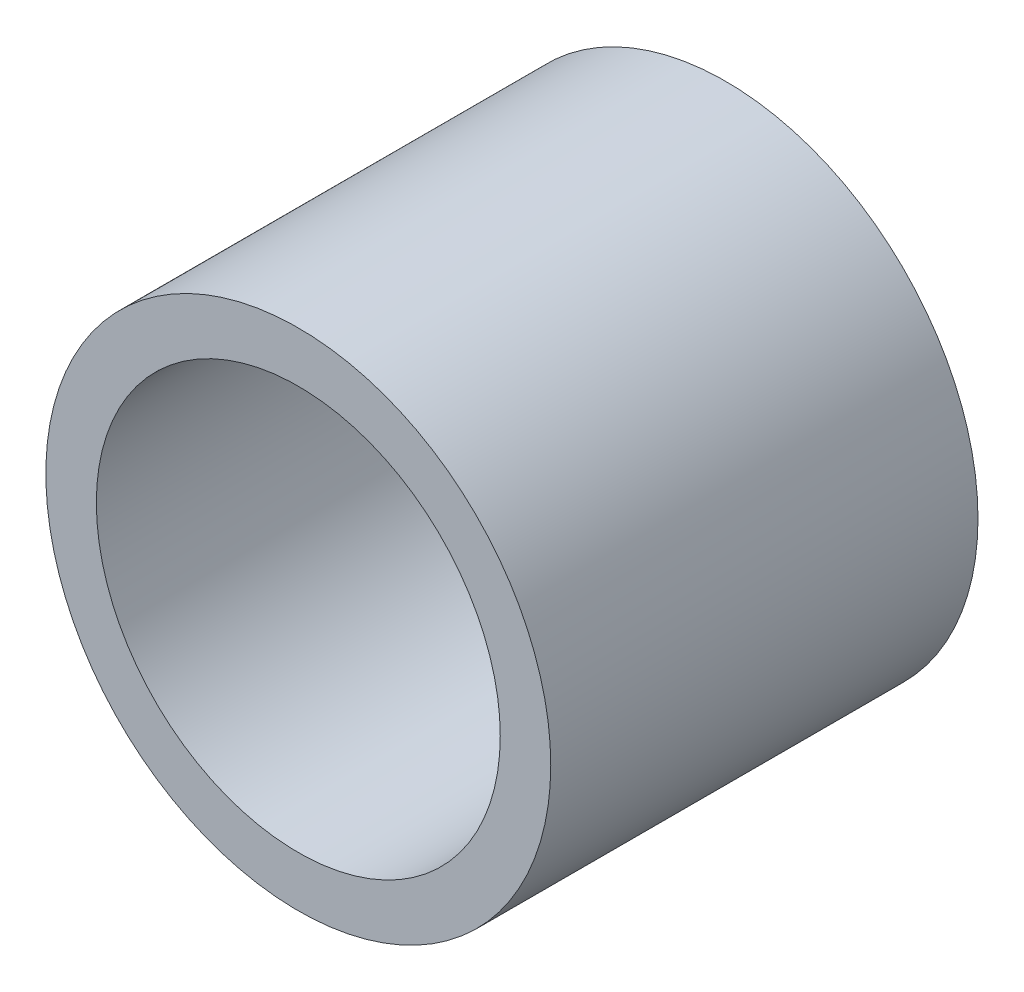
ISO-10303-21;
HEADER;
FILE_DESCRIPTION(('STEP AP214'),'2;1');
FILE_NAME('part.step','',(''),(''),'','','');
FILE_SCHEMA(('AUTOMOTIVE_DESIGN { 1 0 10303 214 1 1 1 1 }'));
ENDSEC;
DATA;
#1=APPLICATION_CONTEXT('core data for automotive mechanical design processes');
#2=APPLICATION_PROTOCOL_DEFINITION('international standard','automotive_design',2000,#1);
#3=PRODUCT_CONTEXT('',#1,'mechanical');
#4=PRODUCT('Part','Part','',(#3));
#5=PRODUCT_RELATED_PRODUCT_CATEGORY('part','',(#4));
#6=PRODUCT_DEFINITION_FORMATION('','',#4);
#7=PRODUCT_DEFINITION_CONTEXT('part definition',#1,'design');
#8=PRODUCT_DEFINITION('design','',#6,#7);
#9=PRODUCT_DEFINITION_SHAPE('','',#8);
#10=(LENGTH_UNIT() NAMED_UNIT(*) SI_UNIT(.MILLI.,.METRE.));
#11=(NAMED_UNIT(*) PLANE_ANGLE_UNIT() SI_UNIT($,.RADIAN.));
#12=(NAMED_UNIT(*) SI_UNIT($,.STERADIAN.) SOLID_ANGLE_UNIT());
#13=UNCERTAINTY_MEASURE_WITH_UNIT(LENGTH_MEASURE(1.E-05),#10,'distance_accuracy_value','');
#14=(GEOMETRIC_REPRESENTATION_CONTEXT(3) GLOBAL_UNCERTAINTY_ASSIGNED_CONTEXT((#13)) GLOBAL_UNIT_ASSIGNED_CONTEXT((#10,
#11,#12)) REPRESENTATION_CONTEXT('',''));
#15=CARTESIAN_POINT('',(0.,0.,0.));
#16=DIRECTION('',(0.,0.,1.));
#17=DIRECTION('',(1.,0.,0.));
#18=AXIS2_PLACEMENT_3D('',#15,#16,#17);
#19=CARTESIAN_POINT('',(0.,0.,-5.5));
#20=DIRECTION('',(0.,0.,1.));
#21=DIRECTION('',(1.,0.,0.));
#22=AXIS2_PLACEMENT_3D('',#19,#20,#21);
#23=CYLINDRICAL_SURFACE('',#22,3.25);
#24=CARTESIAN_POINT('',(0.,0.,-5.5));
#25=DIRECTION('',(0.,0.,1.));
#26=DIRECTION('',(1.,0.,0.));
#27=AXIS2_PLACEMENT_3D('',#24,#25,#26);
#28=CIRCLE('',#27,3.25);
#29=CARTESIAN_POINT('',(3.25,0.,-5.5));
#30=VERTEX_POINT('',#29);
#31=EDGE_CURVE('E10',#30,#30,#28,.T.);
#32=ORIENTED_EDGE('',*,*,#31,.T.);
#33=EDGE_LOOP('',(#32));
#34=FACE_BOUND('',#33,.T.);
#35=CARTESIAN_POINT('',(0.,0.,0.));
#36=DIRECTION('',(0.,0.,1.));
#37=DIRECTION('',(1.,0.,0.));
#38=AXIS2_PLACEMENT_3D('',#35,#36,#37);
#39=CIRCLE('',#38,3.25);
#40=CARTESIAN_POINT('',(3.25,0.,0.));
#41=VERTEX_POINT('',#40);
#42=EDGE_CURVE('E40',#41,#41,#39,.T.);
#43=ORIENTED_EDGE('',*,*,#42,.F.);
#44=EDGE_LOOP('',(#43));
#45=FACE_BOUND('',#44,.T.);
#46=ADVANCED_FACE('F37',(#34,#45),#23,.T.);
#47=CARTESIAN_POINT('',(0.,0.,-5.5));
#48=DIRECTION('',(0.,0.,1.));
#49=DIRECTION('',(1.,0.,0.));
#50=AXIS2_PLACEMENT_3D('',#47,#48,#49);
#51=PLANE('',#50);
#52=CARTESIAN_POINT('',(0.,0.,-5.5));
#53=DIRECTION('',(0.,0.,1.));
#54=DIRECTION('',(1.,0.,0.));
#55=AXIS2_PLACEMENT_3D('',#52,#53,#54);
#56=CIRCLE('',#55,2.6);
#57=CARTESIAN_POINT('',(2.6,0.,-5.5));
#58=VERTEX_POINT('',#57);
#59=EDGE_CURVE('E49',#58,#58,#56,.T.);
#60=ORIENTED_EDGE('',*,*,#59,.T.);
#61=EDGE_LOOP('',(#60));
#62=FACE_BOUND('',#61,.T.);
#63=ORIENTED_EDGE('',*,*,#31,.F.);
#64=EDGE_LOOP('',(#63));
#65=FACE_BOUND('',#64,.T.);
#66=ADVANCED_FACE('F59',(#62,#65),#51,.F.);
#67=CARTESIAN_POINT('',(0.,0.,0.));
#68=DIRECTION('',(0.,0.,1.));
#69=DIRECTION('',(1.,0.,0.));
#70=AXIS2_PLACEMENT_3D('',#67,#68,#69);
#71=PLANE('',#70);
#72=CARTESIAN_POINT('',(0.,0.,0.));
#73=DIRECTION('',(0.,0.,1.));
#74=DIRECTION('',(1.,0.,0.));
#75=AXIS2_PLACEMENT_3D('',#72,#73,#74);
#76=CIRCLE('',#75,2.6);
#77=CARTESIAN_POINT('',(2.6,0.,0.));
#78=VERTEX_POINT('',#77);
#79=EDGE_CURVE('E51',#78,#78,#76,.T.);
#80=ORIENTED_EDGE('',*,*,#79,.F.);
#81=EDGE_LOOP('',(#80));
#82=FACE_BOUND('',#81,.T.);
#83=ORIENTED_EDGE('',*,*,#42,.T.);
#84=EDGE_LOOP('',(#83));
#85=FACE_BOUND('',#84,.T.);
#86=ADVANCED_FACE('F65',(#82,#85),#71,.T.);
#87=CARTESIAN_POINT('',(0.,0.,-5.5));
#88=DIRECTION('',(0.,0.,1.));
#89=DIRECTION('',(1.,0.,0.));
#90=AXIS2_PLACEMENT_3D('',#87,#88,#89);
#91=CYLINDRICAL_SURFACE('',#90,2.6);
#92=ORIENTED_EDGE('',*,*,#59,.F.);
#93=EDGE_LOOP('',(#92));
#94=FACE_BOUND('',#93,.T.);
#95=ORIENTED_EDGE('',*,*,#79,.T.);
#96=EDGE_LOOP('',(#95));
#97=FACE_BOUND('',#96,.T.);
#98=ADVANCED_FACE('F62',(#94,#97),#91,.F.);
#99=CLOSED_SHELL('',(#46,#66,#86,#98));
#100=MANIFOLD_SOLID_BREP('B2',#99);
#101=ADVANCED_BREP_SHAPE_REPRESENTATION('',(#18,#100),#14);
#102=SHAPE_DEFINITION_REPRESENTATION(#9,#101);
ENDSEC;
END-ISO-10303-21;
